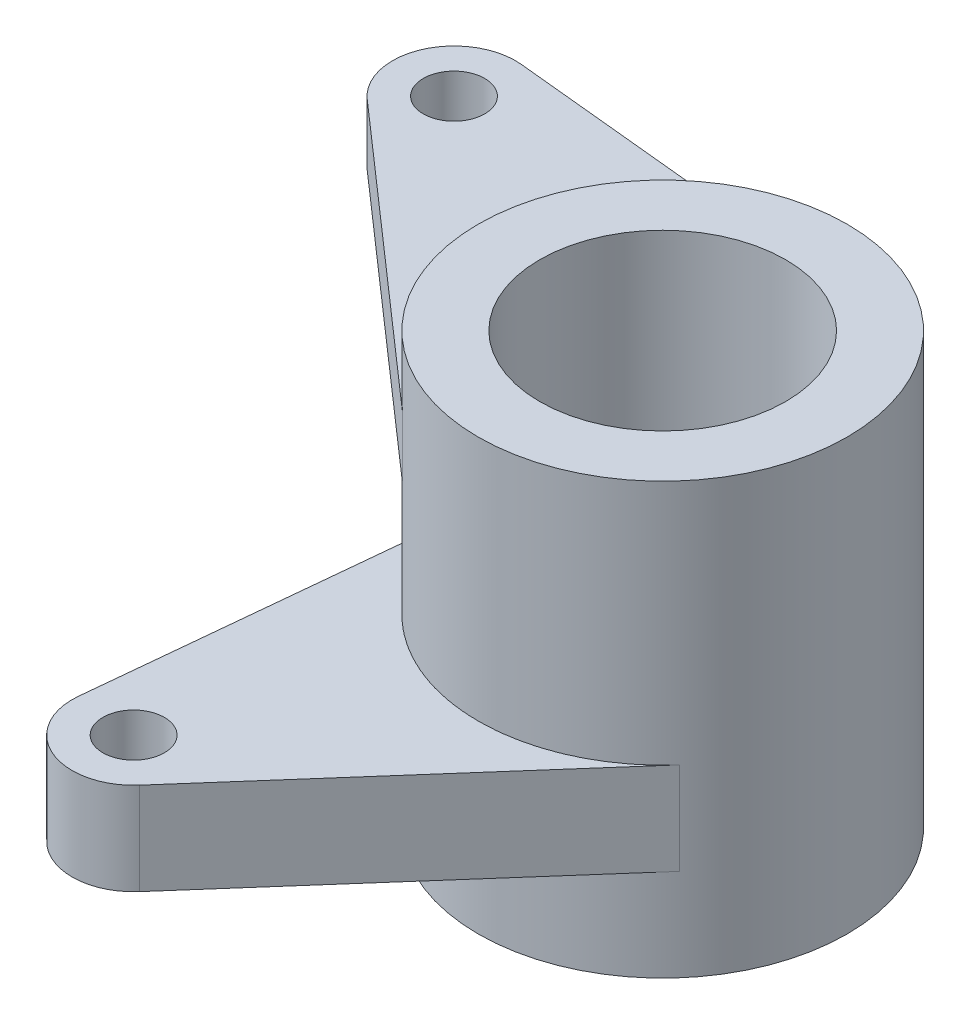
ISO-10303-21;
HEADER;
FILE_DESCRIPTION(('STEP AP214'),'2;1');
FILE_NAME('part.step','',(''),(''),'','','');
FILE_SCHEMA(('AUTOMOTIVE_DESIGN { 1 0 10303 214 1 1 1 1 }'));
ENDSEC;
DATA;
#1=APPLICATION_CONTEXT('core data for automotive mechanical design processes');
#2=APPLICATION_PROTOCOL_DEFINITION('international standard','automotive_design',2000,#1);
#3=PRODUCT_CONTEXT('',#1,'mechanical');
#4=PRODUCT('Part','Part','',(#3));
#5=PRODUCT_RELATED_PRODUCT_CATEGORY('part','',(#4));
#6=PRODUCT_DEFINITION_FORMATION('','',#4);
#7=PRODUCT_DEFINITION_CONTEXT('part definition',#1,'design');
#8=PRODUCT_DEFINITION('design','',#6,#7);
#9=PRODUCT_DEFINITION_SHAPE('','',#8);
#10=(LENGTH_UNIT() NAMED_UNIT(*) SI_UNIT(.MILLI.,.METRE.));
#11=(NAMED_UNIT(*) PLANE_ANGLE_UNIT() SI_UNIT($,.RADIAN.));
#12=(NAMED_UNIT(*) SI_UNIT($,.STERADIAN.) SOLID_ANGLE_UNIT());
#13=UNCERTAINTY_MEASURE_WITH_UNIT(LENGTH_MEASURE(1.E-05),#10,'distance_accuracy_value','');
#14=(GEOMETRIC_REPRESENTATION_CONTEXT(3) GLOBAL_UNCERTAINTY_ASSIGNED_CONTEXT((#13)) GLOBAL_UNIT_ASSIGNED_CONTEXT((#10,
#11,#12)) REPRESENTATION_CONTEXT('',''));
#15=CARTESIAN_POINT('',(0.,0.,0.));
#16=DIRECTION('',(0.,0.,1.));
#17=DIRECTION('',(1.,0.,0.));
#18=AXIS2_PLACEMENT_3D('',#15,#16,#17);
#19=CARTESIAN_POINT('',(0.,-55.,0.));
#20=DIRECTION('',(0.,1.,0.));
#21=DIRECTION('',(1.,0.,0.));
#22=AXIS2_PLACEMENT_3D('',#19,#20,#21);
#23=CYLINDRICAL_SURFACE('',#22,30.);
#24=CARTESIAN_POINT('',(0.,-40.,0.));
#25=DIRECTION('',(0.,-1.,0.));
#26=DIRECTION('',(1.,0.,0.));
#27=AXIS2_PLACEMENT_3D('',#24,#25,#26);
#28=CIRCLE('',#27,30.);
#29=CARTESIAN_POINT('',(22.5458318611067,-40.,19.7910450883905));
#30=VERTEX_POINT('',#29);
#31=CARTESIAN_POINT('',(-29.8531768835766,-40.,-2.96442742496569));
#32=VERTEX_POINT('',#31);
#33=EDGE_CURVE('E112',#30,#32,#28,.T.);
#34=ORIENTED_EDGE('',*,*,#33,.F.);
#35=DIRECTION('',(0.,1.,0.));
#36=VECTOR('',#35,1.);
#37=CARTESIAN_POINT('',(22.5458318611067,-55.,19.7910450883905));
#38=LINE('',#37,#36);
#39=CARTESIAN_POINT('',(22.5458318611067,-55.,19.7910450883905));
#40=VERTEX_POINT('',#39);
#41=EDGE_CURVE('E12',#40,#30,#38,.T.);
#42=ORIENTED_EDGE('',*,*,#41,.F.);
#43=CARTESIAN_POINT('',(0.,-55.,0.));
#44=DIRECTION('',(0.,-1.,0.));
#45=DIRECTION('',(1.,0.,0.));
#46=AXIS2_PLACEMENT_3D('',#43,#44,#45);
#47=CIRCLE('',#46,30.);
#48=CARTESIAN_POINT('',(-29.8531768835766,-55.,-2.96442742496569));
#49=VERTEX_POINT('',#48);
#50=EDGE_CURVE('E105',#40,#49,#47,.T.);
#51=ORIENTED_EDGE('',*,*,#50,.T.);
#52=DIRECTION('',(0.,1.,0.));
#53=VECTOR('',#52,1.);
#54=CARTESIAN_POINT('',(-29.8531768835766,-55.,-2.96442742496569));
#55=LINE('',#54,#53);
#56=EDGE_CURVE('E50',#49,#32,#55,.T.);
#57=ORIENTED_EDGE('',*,*,#56,.T.);
#58=EDGE_LOOP('',(#34,#42,#51,#57));
#59=FACE_BOUND('',#58,.T.);
#60=ADVANCED_FACE('F47',(#59),#23,.F.);
#61=CARTESIAN_POINT('',(-18.5411001809811,-55.,66.5970150294636));
#62=DIRECTION('',(0.751527728703556,0.,0.659701502946351));
#63=DIRECTION('',(0.659701502946351,0.,-0.751527728703556));
#64=AXIS2_PLACEMENT_3D('',#61,#62,#63);
#65=PLANE('',#64);
#66=DIRECTION('',(0.659701502946351,0.,-0.751527728703556));
#67=VECTOR('',#66,1.);
#68=CARTESIAN_POINT('',(-18.5411001809811,-40.,66.5970150294636));
#69=LINE('',#68,#67);
#70=CARTESIAN_POINT('',(-18.5411001809811,-40.,66.5970150294636));
#71=VERTEX_POINT('',#70);
#72=EDGE_CURVE('E107',#71,#30,#69,.T.);
#73=ORIENTED_EDGE('',*,*,#72,.F.);
#74=DIRECTION('',(0.,1.,0.));
#75=VECTOR('',#74,1.);
#76=CARTESIAN_POINT('',(-18.5411001809811,-55.,66.5970150294636));
#77=LINE('',#76,#75);
#78=CARTESIAN_POINT('',(-18.5411001809811,-55.,66.5970150294636));
#79=VERTEX_POINT('',#78);
#80=EDGE_CURVE('E56',#79,#71,#77,.T.);
#81=ORIENTED_EDGE('',*,*,#80,.F.);
#82=DIRECTION('',(0.659701502946351,0.,-0.751527728703556));
#83=VECTOR('',#82,1.);
#84=CARTESIAN_POINT('',(-18.5411001809811,-55.,66.5970150294636));
#85=LINE('',#84,#83);
#86=EDGE_CURVE('E102',#79,#40,#85,.T.);
#87=ORIENTED_EDGE('',*,*,#86,.T.);
#88=ORIENTED_EDGE('',*,*,#41,.T.);
#89=EDGE_LOOP('',(#73,#81,#87,#88));
#90=FACE_BOUND('',#89,.T.);
#91=ADVANCED_FACE('F123',(#90),#65,.T.);
#92=CARTESIAN_POINT('',(-26.0563774680167,-55.,60.0000000000001));
#93=DIRECTION('',(0.,1.,0.));
#94=DIRECTION('',(1.,0.,0.));
#95=AXIS2_PLACEMENT_3D('',#92,#93,#94);
#96=CYLINDRICAL_SURFACE('',#95,9.99999999999999);
#97=CARTESIAN_POINT('',(-26.0563774680167,-40.,60.0000000000001));
#98=DIRECTION('',(0.,1.,0.));
#99=DIRECTION('',(1.,0.,0.));
#100=AXIS2_PLACEMENT_3D('',#97,#98,#99);
#101=CIRCLE('',#100,9.99999999999999);
#102=CARTESIAN_POINT('',(-36.0074364292089,-40.,59.0118575250115));
#103=VERTEX_POINT('',#102);
#104=EDGE_CURVE('E97',#103,#71,#101,.T.);
#105=ORIENTED_EDGE('',*,*,#104,.F.);
#106=DIRECTION('',(0.,1.,0.));
#107=VECTOR('',#106,1.);
#108=CARTESIAN_POINT('',(-36.0074364292089,-55.,59.0118575250115));
#109=LINE('',#108,#107);
#110=CARTESIAN_POINT('',(-36.0074364292089,-55.,59.0118575250115));
#111=VERTEX_POINT('',#110);
#112=EDGE_CURVE('E92',#111,#103,#109,.T.);
#113=ORIENTED_EDGE('',*,*,#112,.F.);
#114=CARTESIAN_POINT('',(-26.0563774680167,-55.,60.0000000000001));
#115=DIRECTION('',(0.,1.,0.));
#116=DIRECTION('',(1.,0.,0.));
#117=AXIS2_PLACEMENT_3D('',#114,#115,#116);
#118=CIRCLE('',#117,9.99999999999999);
#119=EDGE_CURVE('E95',#111,#79,#118,.T.);
#120=ORIENTED_EDGE('',*,*,#119,.T.);
#121=ORIENTED_EDGE('',*,*,#80,.T.);
#122=EDGE_LOOP('',(#105,#113,#120,#121));
#123=FACE_BOUND('',#122,.T.);
#124=ADVANCED_FACE('F94',(#123),#96,.T.);
#125=CARTESIAN_POINT('',(-29.8531768835766,-55.,-2.96442742496569));
#126=DIRECTION('',(-0.995105896119219,0.,-0.0988142474988562));
#127=DIRECTION('',(-0.0988142474988563,0.,0.99510589611922));
#128=AXIS2_PLACEMENT_3D('',#125,#126,#127);
#129=PLANE('',#128);
#130=DIRECTION('',(-0.0988142474988562,0.,0.99510589611922));
#131=VECTOR('',#130,1.);
#132=CARTESIAN_POINT('',(-29.8531768835766,-40.,-2.96442742496569));
#133=LINE('',#132,#131);
#134=EDGE_CURVE('E115',#32,#103,#133,.T.);
#135=ORIENTED_EDGE('',*,*,#134,.F.);
#136=ORIENTED_EDGE('',*,*,#56,.F.);
#137=DIRECTION('',(-0.0988142474988562,0.,0.99510589611922));
#138=VECTOR('',#137,1.);
#139=CARTESIAN_POINT('',(-29.8531768835766,-55.,-2.96442742496569));
#140=LINE('',#139,#138);
#141=EDGE_CURVE('E101',#49,#111,#140,.T.);
#142=ORIENTED_EDGE('',*,*,#141,.T.);
#143=ORIENTED_EDGE('',*,*,#112,.T.);
#144=EDGE_LOOP('',(#135,#136,#142,#143));
#145=FACE_BOUND('',#144,.T.);
#146=ADVANCED_FACE('F104',(#145),#129,.T.);
#147=CARTESIAN_POINT('',(0.,-55.,0.));
#148=DIRECTION('',(0.,1.,0.));
#149=DIRECTION('',(1.,0.,0.));
#150=AXIS2_PLACEMENT_3D('',#147,#148,#149);
#151=PLANE('',#150);
#152=CARTESIAN_POINT('',(-26.0563774680167,-55.,60.0000000000001));
#153=DIRECTION('',(0.,1.,0.));
#154=DIRECTION('',(1.,0.,0.));
#155=AXIS2_PLACEMENT_3D('',#152,#153,#154);
#156=CIRCLE('',#155,5.);
#157=CARTESIAN_POINT('',(-21.0563774680167,-55.,60.0000000000001));
#158=VERTEX_POINT('',#157);
#159=EDGE_CURVE('E116',#158,#158,#156,.T.);
#160=ORIENTED_EDGE('',*,*,#159,.T.);
#161=EDGE_LOOP('',(#160));
#162=FACE_BOUND('',#161,.T.);
#163=ORIENTED_EDGE('',*,*,#50,.F.);
#164=ORIENTED_EDGE('',*,*,#86,.F.);
#165=ORIENTED_EDGE('',*,*,#119,.F.);
#166=ORIENTED_EDGE('',*,*,#141,.F.);
#167=EDGE_LOOP('',(#163,#164,#165,#166));
#168=FACE_BOUND('',#167,.T.);
#169=ADVANCED_FACE('F100',(#162,#168),#151,.F.);
#170=CARTESIAN_POINT('',(0.,-40.,0.));
#171=DIRECTION('',(0.,1.,0.));
#172=DIRECTION('',(1.,0.,0.));
#173=AXIS2_PLACEMENT_3D('',#170,#171,#172);
#174=PLANE('',#173);
#175=CARTESIAN_POINT('',(-26.0563774680167,-40.,60.0000000000001));
#176=DIRECTION('',(0.,1.,0.));
#177=DIRECTION('',(1.,0.,0.));
#178=AXIS2_PLACEMENT_3D('',#175,#176,#177);
#179=CIRCLE('',#178,5.);
#180=CARTESIAN_POINT('',(-21.0563774680167,-40.,60.0000000000001));
#181=VERTEX_POINT('',#180);
#182=EDGE_CURVE('E153',#181,#181,#179,.T.);
#183=ORIENTED_EDGE('',*,*,#182,.F.);
#184=EDGE_LOOP('',(#183));
#185=FACE_BOUND('',#184,.T.);
#186=ORIENTED_EDGE('',*,*,#33,.T.);
#187=ORIENTED_EDGE('',*,*,#134,.T.);
#188=ORIENTED_EDGE('',*,*,#104,.T.);
#189=ORIENTED_EDGE('',*,*,#72,.T.);
#190=EDGE_LOOP('',(#186,#187,#188,#189));
#191=FACE_BOUND('',#190,.T.);
#192=ADVANCED_FACE('F122',(#185,#191),#174,.T.);
#193=CARTESIAN_POINT('',(-26.0563774680167,-55.,60.0000000000001));
#194=DIRECTION('',(0.,1.,0.));
#195=DIRECTION('',(1.,0.,0.));
#196=AXIS2_PLACEMENT_3D('',#193,#194,#195);
#197=CYLINDRICAL_SURFACE('',#196,5.);
#198=ORIENTED_EDGE('',*,*,#159,.F.);
#199=EDGE_LOOP('',(#198));
#200=FACE_BOUND('',#199,.T.);
#201=ORIENTED_EDGE('',*,*,#182,.T.);
#202=EDGE_LOOP('',(#201));
#203=FACE_BOUND('',#202,.T.);
#204=ADVANCED_FACE('F141',(#200,#203),#197,.F.);
#205=CLOSED_SHELL('',(#60,#91,#124,#146,#169,#192,#204));
#206=MANIFOLD_SOLID_BREP('B2',#205);
#207=CARTESIAN_POINT('',(0.,-70.,0.));
#208=DIRECTION('',(0.,1.,0.));
#209=DIRECTION('',(0.,0.,1.));
#210=AXIS2_PLACEMENT_3D('',#207,#208,#209);
#211=CYLINDRICAL_SURFACE('',#210,30.);
#212=CARTESIAN_POINT('',(0.,-70.,0.));
#213=DIRECTION('',(0.,1.,0.));
#214=DIRECTION('',(0.,0.,1.));
#215=AXIS2_PLACEMENT_3D('',#212,#213,#214);
#216=CIRCLE('',#215,30.);
#217=CARTESIAN_POINT('',(0.,-70.,30.));
#218=VERTEX_POINT('',#217);
#219=EDGE_CURVE('E45',#218,#218,#216,.T.);
#220=ORIENTED_EDGE('',*,*,#219,.T.);
#221=EDGE_LOOP('',(#220));
#222=FACE_BOUND('',#221,.T.);
#223=CARTESIAN_POINT('',(0.,0.,0.));
#224=DIRECTION('',(0.,1.,0.));
#225=DIRECTION('',(0.,0.,1.));
#226=AXIS2_PLACEMENT_3D('',#223,#224,#225);
#227=CIRCLE('',#226,30.);
#228=CARTESIAN_POINT('',(0.,0.,30.));
#229=VERTEX_POINT('',#228);
#230=EDGE_CURVE('E195',#229,#229,#227,.T.);
#231=ORIENTED_EDGE('',*,*,#230,.F.);
#232=EDGE_LOOP('',(#231));
#233=FACE_BOUND('',#232,.T.);
#234=DIRECTION('',(0.,1.,0.));
#235=VECTOR('',#234,1.);
#236=CARTESIAN_POINT('',(-19.7910450883906,-20.,22.5458318611066));
#237=LINE('',#236,#235);
#238=CARTESIAN_POINT('',(-19.7910450883906,-20.,22.5458318611066));
#239=VERTEX_POINT('',#238);
#240=CARTESIAN_POINT('',(-19.7910450883906,-10.,22.5458318611066));
#241=VERTEX_POINT('',#240);
#242=EDGE_CURVE('E206',#239,#241,#237,.T.);
#243=ORIENTED_EDGE('',*,*,#242,.F.);
#244=CARTESIAN_POINT('',(0.,-20.,0.));
#245=DIRECTION('',(0.,-1.,0.));
#246=DIRECTION('',(0.,0.,1.));
#247=AXIS2_PLACEMENT_3D('',#244,#245,#246);
#248=CIRCLE('',#247,30.);
#249=CARTESIAN_POINT('',(2.96442742496579,-20.,-29.8531768835766));
#250=VERTEX_POINT('',#249);
#251=EDGE_CURVE('E210',#239,#250,#248,.T.);
#252=ORIENTED_EDGE('',*,*,#251,.T.);
#253=DIRECTION('',(0.,1.,0.));
#254=VECTOR('',#253,1.);
#255=CARTESIAN_POINT('',(2.96442742496579,-20.,-29.8531768835766));
#256=LINE('',#255,#254);
#257=CARTESIAN_POINT('',(2.96442742496579,-10.,-29.8531768835766));
#258=VERTEX_POINT('',#257);
#259=EDGE_CURVE('E242',#250,#258,#256,.T.);
#260=ORIENTED_EDGE('',*,*,#259,.T.);
#261=CARTESIAN_POINT('',(0.,-10.,0.));
#262=DIRECTION('',(0.,-1.,0.));
#263=DIRECTION('',(0.,0.,1.));
#264=AXIS2_PLACEMENT_3D('',#261,#262,#263);
#265=CIRCLE('',#264,30.);
#266=EDGE_CURVE('E258',#241,#258,#265,.T.);
#267=ORIENTED_EDGE('',*,*,#266,.F.);
#268=EDGE_LOOP('',(#243,#252,#260,#267));
#269=FACE_BOUND('',#268,.T.);
#270=ADVANCED_FACE('F192',(#222,#233,#269),#211,.T.);
#271=CARTESIAN_POINT('',(0.,-70.,0.));
#272=DIRECTION('',(0.,1.,0.));
#273=DIRECTION('',(0.,0.,1.));
#274=AXIS2_PLACEMENT_3D('',#271,#272,#273);
#275=PLANE('',#274);
#276=CARTESIAN_POINT('',(0.,-70.,0.));
#277=DIRECTION('',(0.,1.,0.));
#278=DIRECTION('',(0.,0.,1.));
#279=AXIS2_PLACEMENT_3D('',#276,#277,#278);
#280=CIRCLE('',#279,20.);
#281=CARTESIAN_POINT('',(0.,-70.,20.));
#282=VERTEX_POINT('',#281);
#283=EDGE_CURVE('E271',#282,#282,#280,.T.);
#284=ORIENTED_EDGE('',*,*,#283,.T.);
#285=EDGE_LOOP('',(#284));
#286=FACE_BOUND('',#285,.T.);
#287=ORIENTED_EDGE('',*,*,#219,.F.);
#288=EDGE_LOOP('',(#287));
#289=FACE_BOUND('',#288,.T.);
#290=ADVANCED_FACE('F282',(#286,#289),#275,.F.);
#291=CARTESIAN_POINT('',(0.,0.,0.));
#292=DIRECTION('',(0.,1.,0.));
#293=DIRECTION('',(0.,0.,1.));
#294=AXIS2_PLACEMENT_3D('',#291,#292,#293);
#295=PLANE('',#294);
#296=CARTESIAN_POINT('',(0.,0.,0.));
#297=DIRECTION('',(0.,1.,0.));
#298=DIRECTION('',(0.,0.,1.));
#299=AXIS2_PLACEMENT_3D('',#296,#297,#298);
#300=CIRCLE('',#299,20.);
#301=CARTESIAN_POINT('',(0.,0.,20.));
#302=VERTEX_POINT('',#301);
#303=EDGE_CURVE('E268',#302,#302,#300,.T.);
#304=ORIENTED_EDGE('',*,*,#303,.F.);
#305=EDGE_LOOP('',(#304));
#306=FACE_BOUND('',#305,.T.);
#307=ORIENTED_EDGE('',*,*,#230,.T.);
#308=EDGE_LOOP('',(#307));
#309=FACE_BOUND('',#308,.T.);
#310=ADVANCED_FACE('F279',(#306,#309),#295,.T.);
#311=CARTESIAN_POINT('',(0.,-70.,0.));
#312=DIRECTION('',(0.,1.,0.));
#313=DIRECTION('',(0.,0.,1.));
#314=AXIS2_PLACEMENT_3D('',#311,#312,#313);
#315=CYLINDRICAL_SURFACE('',#314,20.);
#316=ORIENTED_EDGE('',*,*,#283,.F.);
#317=EDGE_LOOP('',(#316));
#318=FACE_BOUND('',#317,.T.);
#319=ORIENTED_EDGE('',*,*,#303,.T.);
#320=EDGE_LOOP('',(#319));
#321=FACE_BOUND('',#320,.T.);
#322=ADVANCED_FACE('F277',(#318,#321),#315,.F.);
#323=CARTESIAN_POINT('',(-66.5970150294635,-20.,-18.5411001809814));
#324=DIRECTION('',(-0.659701502946353,0.,0.751527728703554));
#325=DIRECTION('',(0.751527728703554,0.,0.659701502946353));
#326=AXIS2_PLACEMENT_3D('',#323,#324,#325);
#327=PLANE('',#326);
#328=DIRECTION('',(0.751527728703554,0.,0.659701502946353));
#329=VECTOR('',#328,1.);
#330=CARTESIAN_POINT('',(-66.5970150294635,-10.,-18.5411001809814));
#331=LINE('',#330,#329);
#332=CARTESIAN_POINT('',(-66.5970150294635,-10.,-18.5411001809814));
#333=VERTEX_POINT('',#332);
#334=EDGE_CURVE('E253',#333,#241,#331,.T.);
#335=ORIENTED_EDGE('',*,*,#334,.F.);
#336=DIRECTION('',(0.,1.,0.));
#337=VECTOR('',#336,1.);
#338=CARTESIAN_POINT('',(-66.5970150294635,-20.,-18.5411001809814));
#339=LINE('',#338,#337);
#340=CARTESIAN_POINT('',(-66.5970150294635,-20.,-18.5411001809814));
#341=VERTEX_POINT('',#340);
#342=EDGE_CURVE('E241',#341,#333,#339,.T.);
#343=ORIENTED_EDGE('',*,*,#342,.F.);
#344=DIRECTION('',(0.751527728703554,0.,0.659701502946353));
#345=VECTOR('',#344,1.);
#346=CARTESIAN_POINT('',(-66.5970150294635,-20.,-18.5411001809814));
#347=LINE('',#346,#345);
#348=EDGE_CURVE('E249',#341,#239,#347,.T.);
#349=ORIENTED_EDGE('',*,*,#348,.T.);
#350=ORIENTED_EDGE('',*,*,#242,.T.);
#351=EDGE_LOOP('',(#335,#343,#349,#350));
#352=FACE_BOUND('',#351,.T.);
#353=ADVANCED_FACE('F302',(#352),#327,.T.);
#354=CARTESIAN_POINT('',(-60.,-20.,-26.0563774680169));
#355=DIRECTION('',(0.,1.,0.));
#356=DIRECTION('',(0.,0.,1.));
#357=AXIS2_PLACEMENT_3D('',#354,#355,#356);
#358=CYLINDRICAL_SURFACE('',#357,9.99999999999999);
#359=CARTESIAN_POINT('',(-60.,-10.,-26.0563774680169));
#360=DIRECTION('',(0.,1.,0.));
#361=DIRECTION('',(0.,0.,1.));
#362=AXIS2_PLACEMENT_3D('',#359,#360,#361);
#363=CIRCLE('',#362,9.99999999999999);
#364=CARTESIAN_POINT('',(-59.0118575250114,-10.,-36.0074364292091));
#365=VERTEX_POINT('',#364);
#366=EDGE_CURVE('E236',#365,#333,#363,.T.);
#367=ORIENTED_EDGE('',*,*,#366,.F.);
#368=DIRECTION('',(0.,1.,0.));
#369=VECTOR('',#368,1.);
#370=CARTESIAN_POINT('',(-59.0118575250114,-20.,-36.0074364292091));
#371=LINE('',#370,#369);
#372=CARTESIAN_POINT('',(-59.0118575250114,-20.,-36.0074364292091));
#373=VERTEX_POINT('',#372);
#374=EDGE_CURVE('E230',#373,#365,#371,.T.);
#375=ORIENTED_EDGE('',*,*,#374,.F.);
#376=CARTESIAN_POINT('',(-60.,-20.,-26.0563774680169));
#377=DIRECTION('',(0.,1.,0.));
#378=DIRECTION('',(0.,0.,1.));
#379=AXIS2_PLACEMENT_3D('',#376,#377,#378);
#380=CIRCLE('',#379,9.99999999999999);
#381=EDGE_CURVE('E233',#373,#341,#380,.T.);
#382=ORIENTED_EDGE('',*,*,#381,.T.);
#383=ORIENTED_EDGE('',*,*,#342,.T.);
#384=EDGE_LOOP('',(#367,#375,#382,#383));
#385=FACE_BOUND('',#384,.T.);
#386=ADVANCED_FACE('F232',(#385),#358,.T.);
#387=CARTESIAN_POINT('',(2.96442742496579,-20.,-29.8531768835766));
#388=DIRECTION('',(0.0988142474988597,0.,-0.995105896119219));
#389=DIRECTION('',(-0.995105896119219,0.,-0.0988142474988597));
#390=AXIS2_PLACEMENT_3D('',#387,#388,#389);
#391=PLANE('',#390);
#392=DIRECTION('',(-0.995105896119219,0.,-0.0988142474988597));
#393=VECTOR('',#392,1.);
#394=CARTESIAN_POINT('',(2.96442742496579,-10.,-29.8531768835766));
#395=LINE('',#394,#393);
#396=EDGE_CURVE('E261',#258,#365,#395,.T.);
#397=ORIENTED_EDGE('',*,*,#396,.F.);
#398=ORIENTED_EDGE('',*,*,#259,.F.);
#399=DIRECTION('',(-0.995105896119219,0.,-0.0988142474988597));
#400=VECTOR('',#399,1.);
#401=CARTESIAN_POINT('',(2.96442742496579,-20.,-29.8531768835766));
#402=LINE('',#401,#400);
#403=EDGE_CURVE('E247',#250,#373,#402,.T.);
#404=ORIENTED_EDGE('',*,*,#403,.T.);
#405=ORIENTED_EDGE('',*,*,#374,.T.);
#406=EDGE_LOOP('',(#397,#398,#404,#405));
#407=FACE_BOUND('',#406,.T.);
#408=ADVANCED_FACE('F251',(#407),#391,.T.);
#409=CARTESIAN_POINT('',(0.,-20.,0.));
#410=DIRECTION('',(0.,1.,0.));
#411=DIRECTION('',(0.,0.,1.));
#412=AXIS2_PLACEMENT_3D('',#409,#410,#411);
#413=PLANE('',#412);
#414=CARTESIAN_POINT('',(-60.,-20.,-26.0563774680169));
#415=DIRECTION('',(0.,1.,0.));
#416=DIRECTION('',(0.,0.,1.));
#417=AXIS2_PLACEMENT_3D('',#414,#415,#416);
#418=CIRCLE('',#417,5.);
#419=CARTESIAN_POINT('',(-60.,-20.,-21.0563774680169));
#420=VERTEX_POINT('',#419);
#421=EDGE_CURVE('E262',#420,#420,#418,.T.);
#422=ORIENTED_EDGE('',*,*,#421,.T.);
#423=EDGE_LOOP('',(#422));
#424=FACE_BOUND('',#423,.T.);
#425=ORIENTED_EDGE('',*,*,#251,.F.);
#426=ORIENTED_EDGE('',*,*,#348,.F.);
#427=ORIENTED_EDGE('',*,*,#381,.F.);
#428=ORIENTED_EDGE('',*,*,#403,.F.);
#429=EDGE_LOOP('',(#425,#426,#427,#428));
#430=FACE_BOUND('',#429,.T.);
#431=ADVANCED_FACE('F246',(#424,#430),#413,.F.);
#432=CARTESIAN_POINT('',(0.,-10.,0.));
#433=DIRECTION('',(0.,1.,0.));
#434=DIRECTION('',(0.,0.,1.));
#435=AXIS2_PLACEMENT_3D('',#432,#433,#434);
#436=PLANE('',#435);
#437=CARTESIAN_POINT('',(-60.,-10.,-26.0563774680169));
#438=DIRECTION('',(0.,1.,0.));
#439=DIRECTION('',(0.,0.,1.));
#440=AXIS2_PLACEMENT_3D('',#437,#438,#439);
#441=CIRCLE('',#440,5.);
#442=CARTESIAN_POINT('',(-60.,-10.,-21.0563774680169));
#443=VERTEX_POINT('',#442);
#444=EDGE_CURVE('E328',#443,#443,#441,.T.);
#445=ORIENTED_EDGE('',*,*,#444,.F.);
#446=EDGE_LOOP('',(#445));
#447=FACE_BOUND('',#446,.T.);
#448=ORIENTED_EDGE('',*,*,#266,.T.);
#449=ORIENTED_EDGE('',*,*,#396,.T.);
#450=ORIENTED_EDGE('',*,*,#366,.T.);
#451=ORIENTED_EDGE('',*,*,#334,.T.);
#452=EDGE_LOOP('',(#448,#449,#450,#451));
#453=FACE_BOUND('',#452,.T.);
#454=ADVANCED_FACE('F311',(#447,#453),#436,.T.);
#455=CARTESIAN_POINT('',(-60.,-20.,-26.0563774680169));
#456=DIRECTION('',(0.,1.,0.));
#457=DIRECTION('',(0.,0.,1.));
#458=AXIS2_PLACEMENT_3D('',#455,#456,#457);
#459=CYLINDRICAL_SURFACE('',#458,5.);
#460=ORIENTED_EDGE('',*,*,#421,.F.);
#461=EDGE_LOOP('',(#460));
#462=FACE_BOUND('',#461,.T.);
#463=ORIENTED_EDGE('',*,*,#444,.T.);
#464=EDGE_LOOP('',(#463));
#465=FACE_BOUND('',#464,.T.);
#466=ADVANCED_FACE('F314',(#462,#465),#459,.F.);
#467=CLOSED_SHELL('',(#270,#290,#310,#322,#353,#386,#408,#431,#454,#466));
#468=MANIFOLD_SOLID_BREP('B6',#467);
#469=ADVANCED_BREP_SHAPE_REPRESENTATION('',(#18,#206,#468),#14);
#470=SHAPE_DEFINITION_REPRESENTATION(#9,#469);
ENDSEC;
END-ISO-10303-21;
